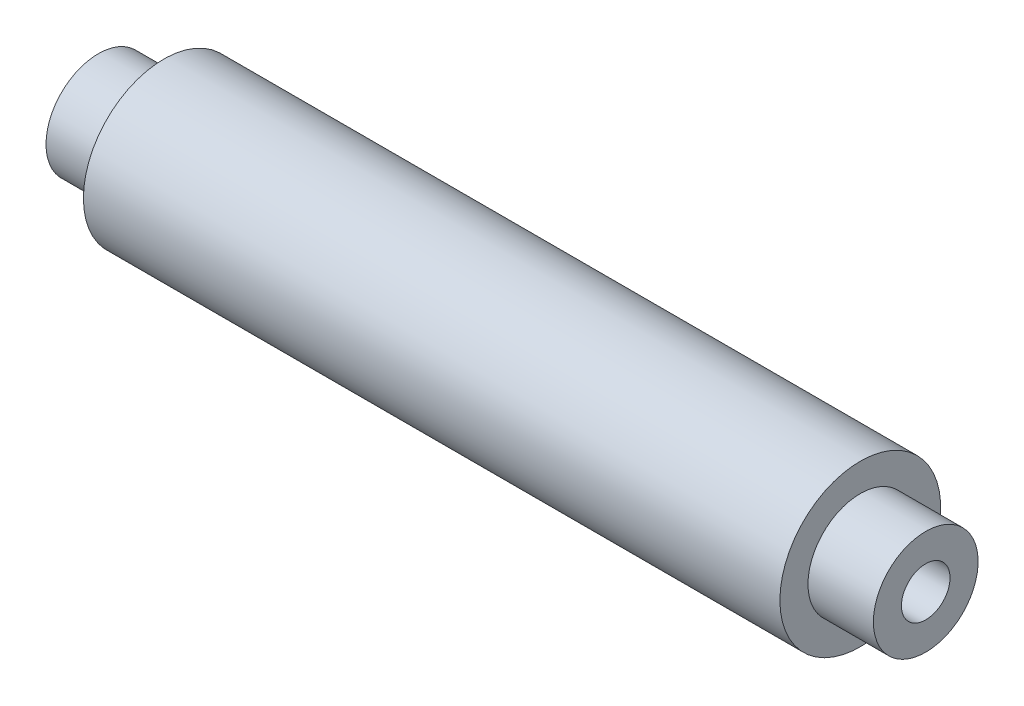
ISO-10303-21;
HEADER;
FILE_DESCRIPTION(('STEP AP214'),'2;1');
FILE_NAME('part.step','',(''),(''),'','','');
FILE_SCHEMA(('AUTOMOTIVE_DESIGN { 1 0 10303 214 1 1 1 1 }'));
ENDSEC;
DATA;
#1=APPLICATION_CONTEXT('core data for automotive mechanical design processes');
#2=APPLICATION_PROTOCOL_DEFINITION('international standard','automotive_design',2000,#1);
#3=PRODUCT_CONTEXT('',#1,'mechanical');
#4=PRODUCT('Part','Part','',(#3));
#5=PRODUCT_RELATED_PRODUCT_CATEGORY('part','',(#4));
#6=PRODUCT_DEFINITION_FORMATION('','',#4);
#7=PRODUCT_DEFINITION_CONTEXT('part definition',#1,'design');
#8=PRODUCT_DEFINITION('design','',#6,#7);
#9=PRODUCT_DEFINITION_SHAPE('','',#8);
#10=(LENGTH_UNIT() NAMED_UNIT(*) SI_UNIT(.MILLI.,.METRE.));
#11=(NAMED_UNIT(*) PLANE_ANGLE_UNIT() SI_UNIT($,.RADIAN.));
#12=(NAMED_UNIT(*) SI_UNIT($,.STERADIAN.) SOLID_ANGLE_UNIT());
#13=UNCERTAINTY_MEASURE_WITH_UNIT(LENGTH_MEASURE(1.E-05),#10,'distance_accuracy_value','');
#14=(GEOMETRIC_REPRESENTATION_CONTEXT(3) GLOBAL_UNCERTAINTY_ASSIGNED_CONTEXT((#13)) GLOBAL_UNIT_ASSIGNED_CONTEXT((#10,
#11,#12)) REPRESENTATION_CONTEXT('',''));
#15=CARTESIAN_POINT('',(0.,0.,0.));
#16=DIRECTION('',(0.,0.,1.));
#17=DIRECTION('',(1.,0.,0.));
#18=AXIS2_PLACEMENT_3D('',#15,#16,#17);
#19=CARTESIAN_POINT('',(0.,2.8,0.));
#20=DIRECTION('',(1.,0.,0.));
#21=DIRECTION('',(0.,0.,-1.));
#22=AXIS2_PLACEMENT_3D('',#19,#20,#21);
#23=PLANE('',#22);
#24=CARTESIAN_POINT('',(0.,0.,0.));
#25=DIRECTION('',(-1.,0.,0.));
#26=DIRECTION('',(0.,0.,1.));
#27=AXIS2_PLACEMENT_3D('',#24,#25,#26);
#28=CIRCLE('',#27,1.3);
#29=CARTESIAN_POINT('',(0.,0.,1.3));
#30=VERTEX_POINT('',#29);
#31=EDGE_CURVE('E10',#30,#30,#28,.T.);
#32=ORIENTED_EDGE('',*,*,#31,.F.);
#33=EDGE_LOOP('',(#32));
#34=FACE_BOUND('',#33,.T.);
#35=CARTESIAN_POINT('',(0.,0.,0.));
#36=DIRECTION('',(-1.,0.,0.));
#37=DIRECTION('',(0.,0.,1.));
#38=AXIS2_PLACEMENT_3D('',#35,#36,#37);
#39=CIRCLE('',#38,2.8);
#40=CARTESIAN_POINT('',(0.,0.,2.8));
#41=VERTEX_POINT('',#40);
#42=EDGE_CURVE('E84',#41,#41,#39,.T.);
#43=ORIENTED_EDGE('',*,*,#42,.T.);
#44=EDGE_LOOP('',(#43));
#45=FACE_BOUND('',#44,.T.);
#46=ADVANCED_FACE('F41',(#34,#45),#23,.F.);
#47=CARTESIAN_POINT('',(0.,0.,0.));
#48=DIRECTION('',(-1.,0.,0.));
#49=DIRECTION('',(0.,0.,1.));
#50=AXIS2_PLACEMENT_3D('',#47,#48,#49);
#51=CYLINDRICAL_SURFACE('',#50,1.3);
#52=CARTESIAN_POINT('',(12.5,0.,0.));
#53=DIRECTION('',(-1.,0.,0.));
#54=DIRECTION('',(0.,0.,1.));
#55=AXIS2_PLACEMENT_3D('',#52,#53,#54);
#56=CIRCLE('',#55,1.3);
#57=CARTESIAN_POINT('',(12.5,0.,1.3));
#58=VERTEX_POINT('',#57);
#59=EDGE_CURVE('E48',#58,#58,#56,.T.);
#60=ORIENTED_EDGE('',*,*,#59,.F.);
#61=EDGE_LOOP('',(#60));
#62=FACE_BOUND('',#61,.T.);
#63=ORIENTED_EDGE('',*,*,#31,.T.);
#64=EDGE_LOOP('',(#63));
#65=FACE_BOUND('',#64,.T.);
#66=ADVANCED_FACE('F139',(#62,#65),#51,.F.);
#67=CARTESIAN_POINT('',(12.5,0.,0.));
#68=DIRECTION('',(1.,0.,0.));
#69=DIRECTION('',(0.,0.,-1.));
#70=AXIS2_PLACEMENT_3D('',#67,#68,#69);
#71=PLANE('',#70);
#72=ORIENTED_EDGE('',*,*,#59,.T.);
#73=EDGE_LOOP('',(#72));
#74=FACE_BOUND('',#73,.T.);
#75=ADVANCED_FACE('F134',(#74),#71,.F.);
#76=CARTESIAN_POINT('',(31.75,1.3,0.));
#77=DIRECTION('',(-1.,0.,0.));
#78=DIRECTION('',(0.,0.,1.));
#79=AXIS2_PLACEMENT_3D('',#76,#77,#78);
#80=PLANE('',#79);
#81=CARTESIAN_POINT('',(31.75,0.,0.));
#82=DIRECTION('',(-1.,0.,0.));
#83=DIRECTION('',(0.,0.,1.));
#84=AXIS2_PLACEMENT_3D('',#81,#82,#83);
#85=CIRCLE('',#84,1.3);
#86=CARTESIAN_POINT('',(31.75,0.,1.3));
#87=VERTEX_POINT('',#86);
#88=EDGE_CURVE('E53',#87,#87,#85,.T.);
#89=ORIENTED_EDGE('',*,*,#88,.F.);
#90=EDGE_LOOP('',(#89));
#91=FACE_BOUND('',#90,.T.);
#92=ADVANCED_FACE('F129',(#91),#80,.F.);
#93=CARTESIAN_POINT('',(0.,0.,0.));
#94=DIRECTION('',(-1.,0.,0.));
#95=DIRECTION('',(0.,0.,1.));
#96=AXIS2_PLACEMENT_3D('',#93,#94,#95);
#97=CYLINDRICAL_SURFACE('',#96,1.3);
#98=CARTESIAN_POINT('',(44.25,0.,0.));
#99=DIRECTION('',(-1.,0.,0.));
#100=DIRECTION('',(0.,0.,1.));
#101=AXIS2_PLACEMENT_3D('',#98,#99,#100);
#102=CIRCLE('',#101,1.3);
#103=CARTESIAN_POINT('',(44.25,0.,1.3));
#104=VERTEX_POINT('',#103);
#105=EDGE_CURVE('E58',#104,#104,#102,.T.);
#106=ORIENTED_EDGE('',*,*,#105,.F.);
#107=EDGE_LOOP('',(#106));
#108=FACE_BOUND('',#107,.T.);
#109=ORIENTED_EDGE('',*,*,#88,.T.);
#110=EDGE_LOOP('',(#109));
#111=FACE_BOUND('',#110,.T.);
#112=ADVANCED_FACE('F123',(#108,#111),#97,.F.);
#113=CARTESIAN_POINT('',(44.25,1.3,0.));
#114=DIRECTION('',(-1.,0.,0.));
#115=DIRECTION('',(0.,0.,1.));
#116=AXIS2_PLACEMENT_3D('',#113,#114,#115);
#117=PLANE('',#116);
#118=CARTESIAN_POINT('',(44.25,0.,0.));
#119=DIRECTION('',(-1.,0.,0.));
#120=DIRECTION('',(0.,0.,1.));
#121=AXIS2_PLACEMENT_3D('',#118,#119,#120);
#122=CIRCLE('',#121,2.80000000000001);
#123=CARTESIAN_POINT('',(44.25,0.,2.80000000000001));
#124=VERTEX_POINT('',#123);
#125=EDGE_CURVE('E64',#124,#124,#122,.T.);
#126=ORIENTED_EDGE('',*,*,#125,.F.);
#127=EDGE_LOOP('',(#126));
#128=FACE_BOUND('',#127,.T.);
#129=ORIENTED_EDGE('',*,*,#105,.T.);
#130=EDGE_LOOP('',(#129));
#131=FACE_BOUND('',#130,.T.);
#132=ADVANCED_FACE('F117',(#128,#131),#117,.F.);
#133=CARTESIAN_POINT('',(0.,0.,0.));
#134=DIRECTION('',(-1.,0.,0.));
#135=DIRECTION('',(0.,0.,1.));
#136=AXIS2_PLACEMENT_3D('',#133,#134,#135);
#137=CYLINDRICAL_SURFACE('',#136,2.80000000000001);
#138=CARTESIAN_POINT('',(40.75,0.,0.));
#139=DIRECTION('',(-1.,0.,0.));
#140=DIRECTION('',(0.,0.,1.));
#141=AXIS2_PLACEMENT_3D('',#138,#139,#140);
#142=CIRCLE('',#141,2.80000000000001);
#143=CARTESIAN_POINT('',(40.75,0.,2.80000000000001));
#144=VERTEX_POINT('',#143);
#145=EDGE_CURVE('E68',#144,#144,#142,.T.);
#146=ORIENTED_EDGE('',*,*,#145,.F.);
#147=EDGE_LOOP('',(#146));
#148=FACE_BOUND('',#147,.T.);
#149=ORIENTED_EDGE('',*,*,#125,.T.);
#150=EDGE_LOOP('',(#149));
#151=FACE_BOUND('',#150,.T.);
#152=ADVANCED_FACE('F111',(#148,#151),#137,.T.);
#153=CARTESIAN_POINT('',(40.75,2.80000000000001,0.));
#154=DIRECTION('',(-1.,0.,0.));
#155=DIRECTION('',(0.,0.,1.));
#156=AXIS2_PLACEMENT_3D('',#153,#154,#155);
#157=PLANE('',#156);
#158=CARTESIAN_POINT('',(40.75,0.,0.));
#159=DIRECTION('',(-1.,0.,0.));
#160=DIRECTION('',(0.,0.,1.));
#161=AXIS2_PLACEMENT_3D('',#158,#159,#160);
#162=CIRCLE('',#161,4.30000000000001);
#163=CARTESIAN_POINT('',(40.75,0.,4.30000000000001));
#164=VERTEX_POINT('',#163);
#165=EDGE_CURVE('E72',#164,#164,#162,.T.);
#166=ORIENTED_EDGE('',*,*,#165,.F.);
#167=EDGE_LOOP('',(#166));
#168=FACE_BOUND('',#167,.T.);
#169=ORIENTED_EDGE('',*,*,#145,.T.);
#170=EDGE_LOOP('',(#169));
#171=FACE_BOUND('',#170,.T.);
#172=ADVANCED_FACE('F105',(#168,#171),#157,.F.);
#173=CARTESIAN_POINT('',(0.,0.,0.));
#174=DIRECTION('',(-1.,0.,0.));
#175=DIRECTION('',(0.,0.,1.));
#176=AXIS2_PLACEMENT_3D('',#173,#174,#175);
#177=CYLINDRICAL_SURFACE('',#176,4.3);
#178=CARTESIAN_POINT('',(3.5,0.,0.));
#179=DIRECTION('',(-1.,0.,0.));
#180=DIRECTION('',(0.,0.,1.));
#181=AXIS2_PLACEMENT_3D('',#178,#179,#180);
#182=CIRCLE('',#181,4.29999999999999);
#183=CARTESIAN_POINT('',(3.5,0.,4.29999999999999));
#184=VERTEX_POINT('',#183);
#185=EDGE_CURVE('E76',#184,#184,#182,.T.);
#186=ORIENTED_EDGE('',*,*,#185,.F.);
#187=EDGE_LOOP('',(#186));
#188=FACE_BOUND('',#187,.T.);
#189=ORIENTED_EDGE('',*,*,#165,.T.);
#190=EDGE_LOOP('',(#189));
#191=FACE_BOUND('',#190,.T.);
#192=ADVANCED_FACE('F99',(#188,#191),#177,.T.);
#193=CARTESIAN_POINT('',(3.5,4.29999999999999,0.));
#194=DIRECTION('',(1.,0.,0.));
#195=DIRECTION('',(0.,0.,-1.));
#196=AXIS2_PLACEMENT_3D('',#193,#194,#195);
#197=PLANE('',#196);
#198=CARTESIAN_POINT('',(3.5,0.,0.));
#199=DIRECTION('',(-1.,0.,0.));
#200=DIRECTION('',(0.,0.,1.));
#201=AXIS2_PLACEMENT_3D('',#198,#199,#200);
#202=CIRCLE('',#201,2.8);
#203=CARTESIAN_POINT('',(3.5,0.,2.8));
#204=VERTEX_POINT('',#203);
#205=EDGE_CURVE('E80',#204,#204,#202,.T.);
#206=ORIENTED_EDGE('',*,*,#205,.F.);
#207=EDGE_LOOP('',(#206));
#208=FACE_BOUND('',#207,.T.);
#209=ORIENTED_EDGE('',*,*,#185,.T.);
#210=EDGE_LOOP('',(#209));
#211=FACE_BOUND('',#210,.T.);
#212=ADVANCED_FACE('F93',(#208,#211),#197,.F.);
#213=CARTESIAN_POINT('',(0.,0.,0.));
#214=DIRECTION('',(-1.,0.,0.));
#215=DIRECTION('',(0.,0.,1.));
#216=AXIS2_PLACEMENT_3D('',#213,#214,#215);
#217=CYLINDRICAL_SURFACE('',#216,2.8);
#218=ORIENTED_EDGE('',*,*,#42,.F.);
#219=EDGE_LOOP('',(#218));
#220=FACE_BOUND('',#219,.T.);
#221=ORIENTED_EDGE('',*,*,#205,.T.);
#222=EDGE_LOOP('',(#221));
#223=FACE_BOUND('',#222,.T.);
#224=ADVANCED_FACE('F90',(#220,#223),#217,.T.);
#225=CLOSED_SHELL('',(#46,#66,#75,#92,#112,#132,#152,#172,#192,#212,#224));
#226=MANIFOLD_SOLID_BREP('B2',#225);
#227=ADVANCED_BREP_SHAPE_REPRESENTATION('',(#18,#226),#14);
#228=SHAPE_DEFINITION_REPRESENTATION(#9,#227);
ENDSEC;
END-ISO-10303-21;
